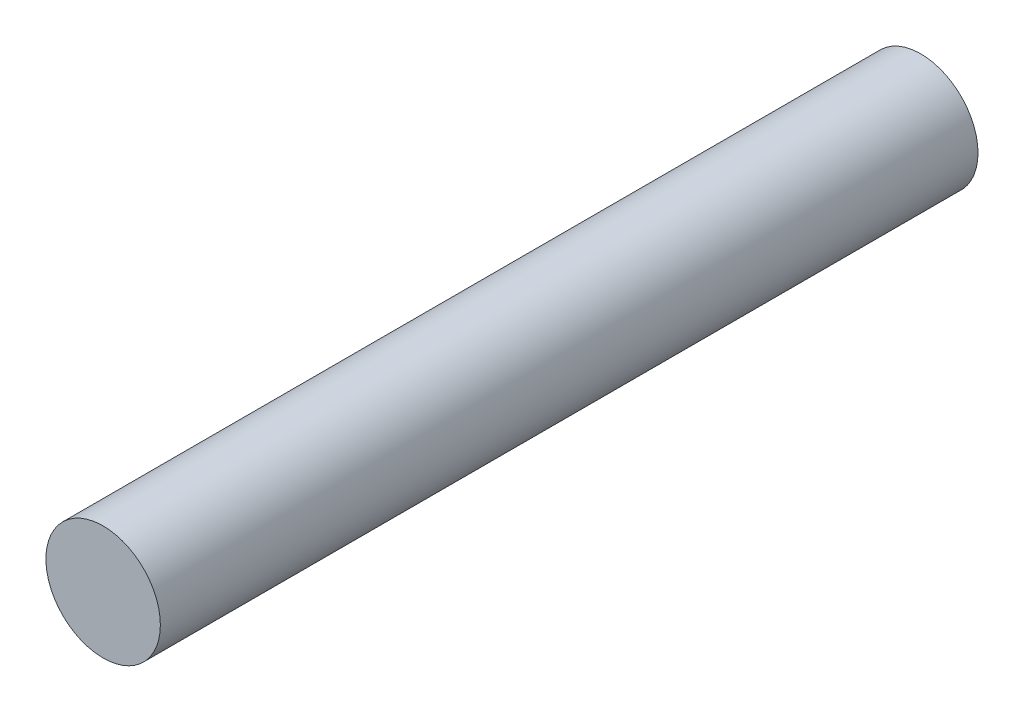
ISO-10303-21;
HEADER;
FILE_DESCRIPTION(('STEP AP214'),'2;1');
FILE_NAME('part.step','',(''),(''),'','','');
FILE_SCHEMA(('AUTOMOTIVE_DESIGN { 1 0 10303 214 1 1 1 1 }'));
ENDSEC;
DATA;
#1=APPLICATION_CONTEXT('core data for automotive mechanical design processes');
#2=APPLICATION_PROTOCOL_DEFINITION('international standard','automotive_design',2000,#1);
#3=PRODUCT_CONTEXT('',#1,'mechanical');
#4=PRODUCT('Part','Part','',(#3));
#5=PRODUCT_RELATED_PRODUCT_CATEGORY('part','',(#4));
#6=PRODUCT_DEFINITION_FORMATION('','',#4);
#7=PRODUCT_DEFINITION_CONTEXT('part definition',#1,'design');
#8=PRODUCT_DEFINITION('design','',#6,#7);
#9=PRODUCT_DEFINITION_SHAPE('','',#8);
#10=(LENGTH_UNIT() NAMED_UNIT(*) SI_UNIT(.MILLI.,.METRE.));
#11=(NAMED_UNIT(*) PLANE_ANGLE_UNIT() SI_UNIT($,.RADIAN.));
#12=(NAMED_UNIT(*) SI_UNIT($,.STERADIAN.) SOLID_ANGLE_UNIT());
#13=UNCERTAINTY_MEASURE_WITH_UNIT(LENGTH_MEASURE(1.E-05),#10,'distance_accuracy_value','');
#14=(GEOMETRIC_REPRESENTATION_CONTEXT(3) GLOBAL_UNCERTAINTY_ASSIGNED_CONTEXT((#13)) GLOBAL_UNIT_ASSIGNED_CONTEXT((#10,
#11,#12)) REPRESENTATION_CONTEXT('',''));
#15=CARTESIAN_POINT('',(0.,0.,0.));
#16=DIRECTION('',(0.,0.,1.));
#17=DIRECTION('',(1.,0.,0.));
#18=AXIS2_PLACEMENT_3D('',#15,#16,#17);
#19=CARTESIAN_POINT('',(-5.59104719919824,1.71199203683829,15.));
#20=DIRECTION('',(0.,0.,-1.));
#21=DIRECTION('',(-1.,0.,0.));
#22=AXIS2_PLACEMENT_3D('',#19,#20,#21);
#23=CYLINDRICAL_SURFACE('',#22,1.05);
#24=CARTESIAN_POINT('',(-5.59104719919824,1.71199203683829,15.));
#25=DIRECTION('',(0.,0.,1.));
#26=DIRECTION('',(1.,0.,0.));
#27=AXIS2_PLACEMENT_3D('',#24,#25,#26);
#28=CIRCLE('',#27,1.05);
#29=CARTESIAN_POINT('',(-4.54104719919824,1.71199203683829,15.));
#30=VERTEX_POINT('',#29);
#31=EDGE_CURVE('E10',#30,#30,#28,.T.);
#32=ORIENTED_EDGE('',*,*,#31,.F.);
#33=EDGE_LOOP('',(#32));
#34=FACE_BOUND('',#33,.T.);
#35=CARTESIAN_POINT('',(-5.59104719919824,1.71199203683829,0.));
#36=DIRECTION('',(0.,0.,1.));
#37=DIRECTION('',(1.,0.,0.));
#38=AXIS2_PLACEMENT_3D('',#35,#36,#37);
#39=CIRCLE('',#38,1.05);
#40=CARTESIAN_POINT('',(-4.54104719919824,1.71199203683829,0.));
#41=VERTEX_POINT('',#40);
#42=EDGE_CURVE('E40',#41,#41,#39,.T.);
#43=ORIENTED_EDGE('',*,*,#42,.T.);
#44=EDGE_LOOP('',(#43));
#45=FACE_BOUND('',#44,.T.);
#46=ADVANCED_FACE('F37',(#34,#45),#23,.T.);
#47=CARTESIAN_POINT('',(-5.59104719919824,1.71199203683829,15.));
#48=DIRECTION('',(0.,0.,1.));
#49=DIRECTION('',(1.,0.,0.));
#50=AXIS2_PLACEMENT_3D('',#47,#48,#49);
#51=PLANE('',#50);
#52=ORIENTED_EDGE('',*,*,#31,.T.);
#53=EDGE_LOOP('',(#52));
#54=FACE_BOUND('',#53,.T.);
#55=ADVANCED_FACE('F54',(#54),#51,.T.);
#56=CARTESIAN_POINT('',(-5.59104719919824,1.71199203683829,0.));
#57=DIRECTION('',(0.,0.,1.));
#58=DIRECTION('',(1.,0.,0.));
#59=AXIS2_PLACEMENT_3D('',#56,#57,#58);
#60=PLANE('',#59);
#61=ORIENTED_EDGE('',*,*,#42,.F.);
#62=EDGE_LOOP('',(#61));
#63=FACE_BOUND('',#62,.T.);
#64=ADVANCED_FACE('F52',(#63),#60,.F.);
#65=CLOSED_SHELL('',(#46,#55,#64));
#66=MANIFOLD_SOLID_BREP('B2',#65);
#67=ADVANCED_BREP_SHAPE_REPRESENTATION('',(#18,#66),#14);
#68=SHAPE_DEFINITION_REPRESENTATION(#9,#67);
ENDSEC;
END-ISO-10303-21;
